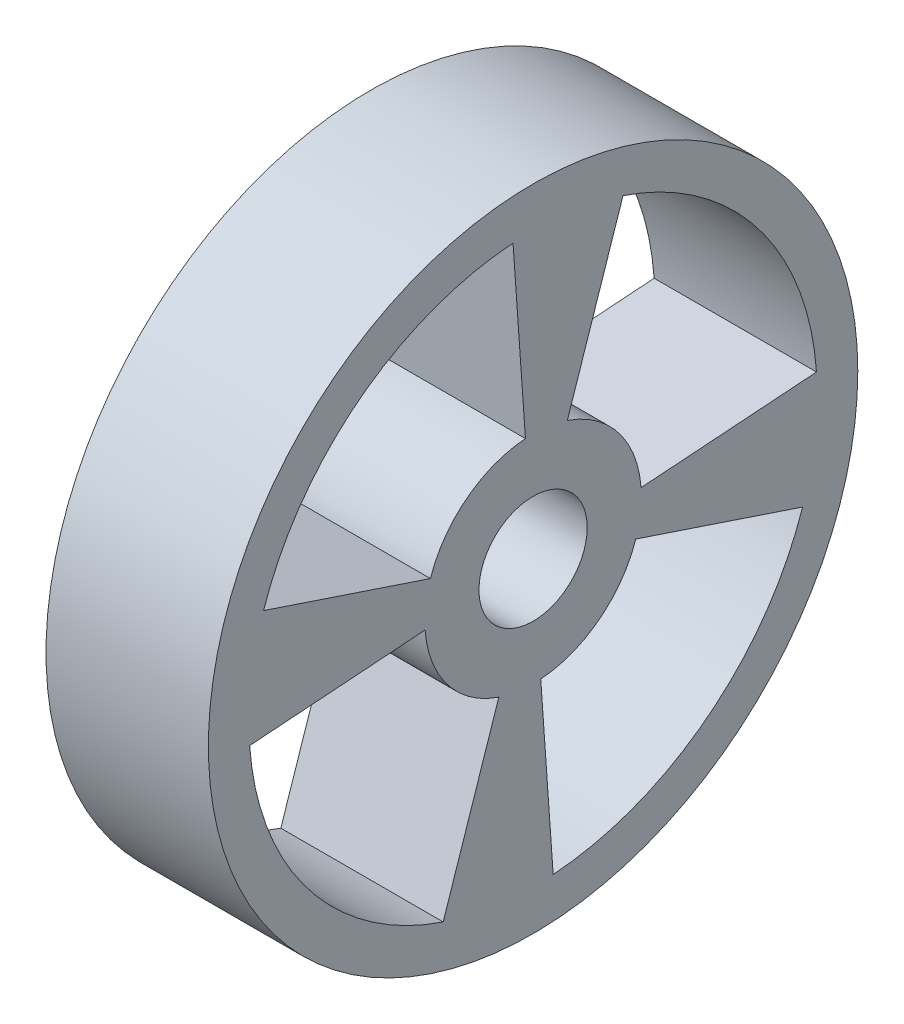
ISO-10303-21;
HEADER;
FILE_DESCRIPTION(('STEP AP214'),'2;1');
FILE_NAME('part.step','',(''),(''),'','','');
FILE_SCHEMA(('AUTOMOTIVE_DESIGN { 1 0 10303 214 1 1 1 1 }'));
ENDSEC;
DATA;
#1=APPLICATION_CONTEXT('core data for automotive mechanical design processes');
#2=APPLICATION_PROTOCOL_DEFINITION('international standard','automotive_design',2000,#1);
#3=PRODUCT_CONTEXT('',#1,'mechanical');
#4=PRODUCT('Part','Part','',(#3));
#5=PRODUCT_RELATED_PRODUCT_CATEGORY('part','',(#4));
#6=PRODUCT_DEFINITION_FORMATION('','',#4);
#7=PRODUCT_DEFINITION_CONTEXT('part definition',#1,'design');
#8=PRODUCT_DEFINITION('design','',#6,#7);
#9=PRODUCT_DEFINITION_SHAPE('','',#8);
#10=(LENGTH_UNIT() NAMED_UNIT(*) SI_UNIT(.MILLI.,.METRE.));
#11=(NAMED_UNIT(*) PLANE_ANGLE_UNIT() SI_UNIT($,.RADIAN.));
#12=(NAMED_UNIT(*) SI_UNIT($,.STERADIAN.) SOLID_ANGLE_UNIT());
#13=UNCERTAINTY_MEASURE_WITH_UNIT(LENGTH_MEASURE(1.E-05),#10,'distance_accuracy_value','');
#14=(GEOMETRIC_REPRESENTATION_CONTEXT(3) GLOBAL_UNCERTAINTY_ASSIGNED_CONTEXT((#13)) GLOBAL_UNIT_ASSIGNED_CONTEXT((#10,
#11,#12)) REPRESENTATION_CONTEXT('',''));
#15=CARTESIAN_POINT('',(0.,0.,0.));
#16=DIRECTION('',(0.,0.,1.));
#17=DIRECTION('',(1.,0.,0.));
#18=AXIS2_PLACEMENT_3D('',#15,#16,#17);
#19=CARTESIAN_POINT('',(6.,0.,0.));
#20=DIRECTION('',(-1.,0.,0.));
#21=DIRECTION('',(0.,0.,1.));
#22=AXIS2_PLACEMENT_3D('',#19,#20,#21);
#23=CYLINDRICAL_SURFACE('',#22,10.5);
#24=CARTESIAN_POINT('',(0.,0.,0.));
#25=DIRECTION('',(1.,0.,0.));
#26=DIRECTION('',(0.,0.,-1.));
#27=AXIS2_PLACEMENT_3D('',#24,#25,#26);
#28=CIRCLE('',#27,10.5);
#29=CARTESIAN_POINT('',(0.,0.741872062862505,-10.4737589165659));
#30=VERTEX_POINT('',#29);
#31=CARTESIAN_POINT('',(0.,9.96039363886485,-3.32273359733529));
#32=VERTEX_POINT('',#31);
#33=EDGE_CURVE('E210',#30,#32,#28,.T.);
#34=ORIENTED_EDGE('',*,*,#33,.F.);
#35=DIRECTION('',(-1.,0.,0.));
#36=VECTOR('',#35,1.);
#37=CARTESIAN_POINT('',(6.,0.741872062862505,-10.4737589165659));
#38=LINE('',#37,#36);
#39=CARTESIAN_POINT('',(6.,0.741872062862505,-10.4737589165659));
#40=VERTEX_POINT('',#39);
#41=EDGE_CURVE('E11',#40,#30,#38,.T.);
#42=ORIENTED_EDGE('',*,*,#41,.F.);
#43=CARTESIAN_POINT('',(6.,0.,0.));
#44=DIRECTION('',(1.,0.,0.));
#45=DIRECTION('',(0.,0.,-1.));
#46=AXIS2_PLACEMENT_3D('',#43,#44,#45);
#47=CIRCLE('',#46,10.5);
#48=CARTESIAN_POINT('',(6.,9.96039363886485,-3.32273359733529));
#49=VERTEX_POINT('',#48);
#50=EDGE_CURVE('E179',#40,#49,#47,.T.);
#51=ORIENTED_EDGE('',*,*,#50,.T.);
#52=DIRECTION('',(-1.,0.,0.));
#53=VECTOR('',#52,1.);
#54=CARTESIAN_POINT('',(6.,9.96039363886485,-3.32273359733529));
#55=LINE('',#54,#53);
#56=EDGE_CURVE('E114',#49,#32,#55,.T.);
#57=ORIENTED_EDGE('',*,*,#56,.T.);
#58=EDGE_LOOP('',(#34,#42,#51,#57));
#59=FACE_BOUND('',#58,.T.);
#60=ADVANCED_FACE('F36',(#59),#23,.F.);
#61=CARTESIAN_POINT('',(6.,0.,0.));
#62=DIRECTION('',(0.,0.997500849196754,0.0706544821773814));
#63=DIRECTION('',(0.,-0.0706544821773815,0.997500849196755));
#64=AXIS2_PLACEMENT_3D('',#61,#62,#63);
#65=PLANE('',#64);
#66=DIRECTION('',(0.,0.0706544821773815,-0.997500849196755));
#67=VECTOR('',#66,1.);
#68=CARTESIAN_POINT('',(0.,0.,0.));
#69=LINE('',#68,#67);
#70=CARTESIAN_POINT('',(0.,0.282617928709526,-3.99000339678702));
#71=VERTEX_POINT('',#70);
#72=EDGE_CURVE('E166',#71,#30,#69,.T.);
#73=ORIENTED_EDGE('',*,*,#72,.F.);
#74=DIRECTION('',(-1.,0.,0.));
#75=VECTOR('',#74,1.);
#76=CARTESIAN_POINT('',(6.,0.282617928709526,-3.99000339678702));
#77=LINE('',#76,#75);
#78=CARTESIAN_POINT('',(6.,0.282617928709526,-3.99000339678702));
#79=VERTEX_POINT('',#78);
#80=EDGE_CURVE('E46',#79,#71,#77,.T.);
#81=ORIENTED_EDGE('',*,*,#80,.F.);
#82=DIRECTION('',(0.,0.0706544821773815,-0.997500849196755));
#83=VECTOR('',#82,1.);
#84=CARTESIAN_POINT('',(6.,0.,0.));
#85=LINE('',#84,#83);
#86=EDGE_CURVE('E164',#79,#40,#85,.T.);
#87=ORIENTED_EDGE('',*,*,#86,.T.);
#88=ORIENTED_EDGE('',*,*,#41,.T.);
#89=EDGE_LOOP('',(#73,#81,#87,#88));
#90=FACE_BOUND('',#89,.T.);
#91=ADVANCED_FACE('F162',(#90),#65,.T.);
#92=CARTESIAN_POINT('',(6.,0.,0.));
#93=DIRECTION('',(-1.,0.,0.));
#94=DIRECTION('',(0.,0.,1.));
#95=AXIS2_PLACEMENT_3D('',#92,#93,#94);
#96=CYLINDRICAL_SURFACE('',#95,4.);
#97=CARTESIAN_POINT('',(0.,0.,0.));
#98=DIRECTION('',(1.,0.,0.));
#99=DIRECTION('',(0.,0.,-1.));
#100=AXIS2_PLACEMENT_3D('',#97,#98,#99);
#101=CIRCLE('',#100,4.);
#102=CARTESIAN_POINT('',(0.,3.79443567194851,-1.26580327517535));
#103=VERTEX_POINT('',#102);
#104=EDGE_CURVE('E202',#71,#103,#101,.T.);
#105=ORIENTED_EDGE('',*,*,#104,.T.);
#106=DIRECTION('',(-1.,0.,0.));
#107=VECTOR('',#106,1.);
#108=CARTESIAN_POINT('',(6.,3.79443567194851,-1.26580327517535));
#109=LINE('',#108,#107);
#110=CARTESIAN_POINT('',(6.,3.79443567194851,-1.26580327517535));
#111=VERTEX_POINT('',#110);
#112=EDGE_CURVE('E169',#111,#103,#109,.T.);
#113=ORIENTED_EDGE('',*,*,#112,.F.);
#114=CARTESIAN_POINT('',(6.,0.,0.));
#115=DIRECTION('',(1.,0.,0.));
#116=DIRECTION('',(0.,0.,-1.));
#117=AXIS2_PLACEMENT_3D('',#114,#115,#116);
#118=CIRCLE('',#117,4.);
#119=EDGE_CURVE('E172',#79,#111,#118,.T.);
#120=ORIENTED_EDGE('',*,*,#119,.F.);
#121=ORIENTED_EDGE('',*,*,#80,.T.);
#122=EDGE_LOOP('',(#105,#113,#120,#121));
#123=FACE_BOUND('',#122,.T.);
#124=ADVANCED_FACE('F173',(#123),#96,.T.);
#125=CARTESIAN_POINT('',(6.,0.,0.));
#126=DIRECTION('',(0.,-0.0706544821773849,0.997500849196754));
#127=DIRECTION('',(0.,-0.997500849196754,-0.0706544821773849));
#128=AXIS2_PLACEMENT_3D('',#125,#126,#127);
#129=PLANE('',#128);
#130=DIRECTION('',(0.,0.997500849196754,0.0706544821773849));
#131=VECTOR('',#130,1.);
#132=CARTESIAN_POINT('',(0.,0.,0.));
#133=LINE('',#132,#131);
#134=CARTESIAN_POINT('',(0.,3.99000339678702,0.28261792870954));
#135=VERTEX_POINT('',#134);
#136=CARTESIAN_POINT('',(0.,10.4737589165659,0.741872062862542));
#137=VERTEX_POINT('',#136);
#138=EDGE_CURVE('E217',#135,#137,#133,.T.);
#139=ORIENTED_EDGE('',*,*,#138,.F.);
#140=DIRECTION('',(-1.,0.,0.));
#141=VECTOR('',#140,1.);
#142=CARTESIAN_POINT('',(6.,3.99000339678702,0.28261792870954));
#143=LINE('',#142,#141);
#144=CARTESIAN_POINT('',(6.,3.99000339678702,0.28261792870954));
#145=VERTEX_POINT('',#144);
#146=EDGE_CURVE('E235',#145,#135,#143,.T.);
#147=ORIENTED_EDGE('',*,*,#146,.F.);
#148=DIRECTION('',(0.,0.997500849196754,0.0706544821773849));
#149=VECTOR('',#148,1.);
#150=CARTESIAN_POINT('',(6.,0.,0.));
#151=LINE('',#150,#149);
#152=CARTESIAN_POINT('',(6.,10.4737589165659,0.741872062862542));
#153=VERTEX_POINT('',#152);
#154=EDGE_CURVE('E380',#145,#153,#151,.T.);
#155=ORIENTED_EDGE('',*,*,#154,.T.);
#156=DIRECTION('',(-1.,0.,0.));
#157=VECTOR('',#156,1.);
#158=CARTESIAN_POINT('',(6.,10.4737589165659,0.741872062862542));
#159=LINE('',#158,#157);
#160=EDGE_CURVE('E237',#153,#137,#159,.T.);
#161=ORIENTED_EDGE('',*,*,#160,.T.);
#162=EDGE_LOOP('',(#139,#147,#155,#161));
#163=FACE_BOUND('',#162,.T.);
#164=ADVANCED_FACE('F351',(#163),#129,.T.);
#165=CARTESIAN_POINT('',(0.,1.26580327517539,3.7944356719485));
#166=VERTEX_POINT('',#165);
#167=EDGE_CURVE('E220',#135,#166,#101,.T.);
#168=ORIENTED_EDGE('',*,*,#167,.T.);
#169=DIRECTION('',(-1.,0.,0.));
#170=VECTOR('',#169,1.);
#171=CARTESIAN_POINT('',(6.,1.26580327517539,3.7944356719485));
#172=LINE('',#171,#170);
#173=CARTESIAN_POINT('',(6.,1.26580327517539,3.7944356719485));
#174=VERTEX_POINT('',#173);
#175=EDGE_CURVE('E242',#174,#166,#172,.T.);
#176=ORIENTED_EDGE('',*,*,#175,.F.);
#177=EDGE_CURVE('E175',#145,#174,#118,.T.);
#178=ORIENTED_EDGE('',*,*,#177,.F.);
#179=ORIENTED_EDGE('',*,*,#146,.T.);
#180=EDGE_LOOP('',(#168,#176,#178,#179));
#181=FACE_BOUND('',#180,.T.);
#182=ADVANCED_FACE('F352',(#181),#96,.T.);
#183=CARTESIAN_POINT('',(6.,0.,0.));
#184=DIRECTION('',(0.,-0.948608917987125,0.316450818793847));
#185=DIRECTION('',(0.,-0.316450818793847,-0.948608917987125));
#186=AXIS2_PLACEMENT_3D('',#183,#184,#185);
#187=PLANE('',#186);
#188=DIRECTION('',(0.,0.316450818793847,0.948608917987125));
#189=VECTOR('',#188,1.);
#190=CARTESIAN_POINT('',(0.,0.,0.));
#191=LINE('',#190,#189);
#192=CARTESIAN_POINT('',(0.,3.32273359733539,9.96039363886481));
#193=VERTEX_POINT('',#192);
#194=EDGE_CURVE('E221',#166,#193,#191,.T.);
#195=ORIENTED_EDGE('',*,*,#194,.T.);
#196=DIRECTION('',(-1.,0.,0.));
#197=VECTOR('',#196,1.);
#198=CARTESIAN_POINT('',(6.,3.32273359733539,9.96039363886481));
#199=LINE('',#198,#197);
#200=CARTESIAN_POINT('',(6.,3.32273359733539,9.96039363886481));
#201=VERTEX_POINT('',#200);
#202=EDGE_CURVE('E239',#201,#193,#199,.T.);
#203=ORIENTED_EDGE('',*,*,#202,.F.);
#204=DIRECTION('',(0.,0.316450818793847,0.948608917987125));
#205=VECTOR('',#204,1.);
#206=CARTESIAN_POINT('',(6.,0.,0.));
#207=LINE('',#206,#205);
#208=EDGE_CURVE('E186',#174,#201,#207,.T.);
#209=ORIENTED_EDGE('',*,*,#208,.F.);
#210=ORIENTED_EDGE('',*,*,#175,.T.);
#211=EDGE_LOOP('',(#195,#203,#209,#210));
#212=FACE_BOUND('',#211,.T.);
#213=ADVANCED_FACE('F359',(#212),#187,.F.);
#214=CARTESIAN_POINT('',(6.,0.,0.));
#215=DIRECTION('',(0.,-0.997500849196755,-0.0706544821773745));
#216=DIRECTION('',(0.,0.0706544821773745,-0.997500849196755));
#217=AXIS2_PLACEMENT_3D('',#214,#215,#216);
#218=PLANE('',#217);
#219=DIRECTION('',(0.,-0.0706544821773745,0.997500849196755));
#220=VECTOR('',#219,1.);
#221=CARTESIAN_POINT('',(0.,0.,0.));
#222=LINE('',#221,#220);
#223=CARTESIAN_POINT('',(0.,-0.282617928709498,3.99000339678702));
#224=VERTEX_POINT('',#223);
#225=CARTESIAN_POINT('',(0.,-0.741872062862432,10.4737589165659));
#226=VERTEX_POINT('',#225);
#227=EDGE_CURVE('E209',#224,#226,#222,.T.);
#228=ORIENTED_EDGE('',*,*,#227,.F.);
#229=DIRECTION('',(-1.,0.,0.));
#230=VECTOR('',#229,1.);
#231=CARTESIAN_POINT('',(6.,-0.282617928709498,3.99000339678702));
#232=LINE('',#231,#230);
#233=CARTESIAN_POINT('',(6.,-0.282617928709498,3.99000339678702));
#234=VERTEX_POINT('',#233);
#235=EDGE_CURVE('E240',#234,#224,#232,.T.);
#236=ORIENTED_EDGE('',*,*,#235,.F.);
#237=DIRECTION('',(0.,-0.0706544821773745,0.997500849196755));
#238=VECTOR('',#237,1.);
#239=CARTESIAN_POINT('',(6.,0.,0.));
#240=LINE('',#239,#238);
#241=CARTESIAN_POINT('',(6.,-0.741872062862432,10.4737589165659));
#242=VERTEX_POINT('',#241);
#243=EDGE_CURVE('E375',#234,#242,#240,.T.);
#244=ORIENTED_EDGE('',*,*,#243,.T.);
#245=DIRECTION('',(-1.,0.,0.));
#246=VECTOR('',#245,1.);
#247=CARTESIAN_POINT('',(6.,-0.741872062862432,10.4737589165659));
#248=LINE('',#247,#246);
#249=EDGE_CURVE('E246',#242,#226,#248,.T.);
#250=ORIENTED_EDGE('',*,*,#249,.T.);
#251=EDGE_LOOP('',(#228,#236,#244,#250));
#252=FACE_BOUND('',#251,.T.);
#253=ADVANCED_FACE('F363',(#252),#218,.T.);
#254=CARTESIAN_POINT('',(0.,-3.7944356719485,1.26580327517537));
#255=VERTEX_POINT('',#254);
#256=EDGE_CURVE('E203',#224,#255,#101,.T.);
#257=ORIENTED_EDGE('',*,*,#256,.T.);
#258=DIRECTION('',(-1.,0.,0.));
#259=VECTOR('',#258,1.);
#260=CARTESIAN_POINT('',(6.,-3.7944356719485,1.26580327517537));
#261=LINE('',#260,#259);
#262=CARTESIAN_POINT('',(6.,-3.7944356719485,1.26580327517537));
#263=VERTEX_POINT('',#262);
#264=EDGE_CURVE('E250',#263,#255,#261,.T.);
#265=ORIENTED_EDGE('',*,*,#264,.F.);
#266=EDGE_CURVE('E377',#234,#263,#118,.T.);
#267=ORIENTED_EDGE('',*,*,#266,.F.);
#268=ORIENTED_EDGE('',*,*,#235,.T.);
#269=EDGE_LOOP('',(#257,#265,#267,#268));
#270=FACE_BOUND('',#269,.T.);
#271=ADVANCED_FACE('F286',(#270),#96,.T.);
#272=CARTESIAN_POINT('',(6.,0.,0.));
#273=DIRECTION('',(0.,-0.31645081879382,-0.948608917987134));
#274=DIRECTION('',(0.,0.948608917987134,-0.31645081879382));
#275=AXIS2_PLACEMENT_3D('',#272,#273,#274);
#276=PLANE('',#275);
#277=DIRECTION('',(0.,-0.948608917987134,0.31645081879382));
#278=VECTOR('',#277,1.);
#279=CARTESIAN_POINT('',(0.,0.,0.));
#280=LINE('',#279,#278);
#281=CARTESIAN_POINT('',(0.,-9.96039363886477,3.32273359733517));
#282=VERTEX_POINT('',#281);
#283=EDGE_CURVE('E214',#255,#282,#280,.T.);
#284=ORIENTED_EDGE('',*,*,#283,.T.);
#285=DIRECTION('',(-1.,0.,0.));
#286=VECTOR('',#285,1.);
#287=CARTESIAN_POINT('',(6.,-9.96039363886477,3.32273359733517));
#288=LINE('',#287,#286);
#289=CARTESIAN_POINT('',(6.,-9.96039363886477,3.32273359733517));
#290=VERTEX_POINT('',#289);
#291=EDGE_CURVE('E248',#290,#282,#288,.T.);
#292=ORIENTED_EDGE('',*,*,#291,.F.);
#293=DIRECTION('',(0.,-0.948608917987134,0.31645081879382));
#294=VECTOR('',#293,1.);
#295=CARTESIAN_POINT('',(6.,0.,0.));
#296=LINE('',#295,#294);
#297=EDGE_CURVE('E327',#263,#290,#296,.T.);
#298=ORIENTED_EDGE('',*,*,#297,.F.);
#299=ORIENTED_EDGE('',*,*,#264,.T.);
#300=EDGE_LOOP('',(#284,#292,#298,#299));
#301=FACE_BOUND('',#300,.T.);
#302=ADVANCED_FACE('F324',(#301),#276,.F.);
#303=CARTESIAN_POINT('',(6.,0.,1.22965707227772E-13));
#304=DIRECTION('',(0.,0.0706544821774087,-0.997500849196753));
#305=DIRECTION('',(0.,0.997500849196753,0.0706544821774087));
#306=AXIS2_PLACEMENT_3D('',#303,#304,#305);
#307=PLANE('',#306);
#308=DIRECTION('',(0.,-0.997500849196752,-0.0706544821774087));
#309=VECTOR('',#308,1.);
#310=CARTESIAN_POINT('',(0.,0.,1.22965707227772E-13));
#311=LINE('',#310,#309);
#312=CARTESIAN_POINT('',(0.,-3.99000339678702,-0.282617928709512));
#313=VERTEX_POINT('',#312);
#314=CARTESIAN_POINT('',(0.,-10.4737589165658,-0.741872062862661));
#315=VERTEX_POINT('',#314);
#316=EDGE_CURVE('E196',#313,#315,#311,.T.);
#317=ORIENTED_EDGE('',*,*,#316,.F.);
#318=DIRECTION('',(-1.,0.,0.));
#319=VECTOR('',#318,1.);
#320=CARTESIAN_POINT('',(6.,-3.99000339678702,-0.282617928709512));
#321=LINE('',#320,#319);
#322=CARTESIAN_POINT('',(6.,-3.99000339678702,-0.282617928709512));
#323=VERTEX_POINT('',#322);
#324=EDGE_CURVE('E40',#323,#313,#321,.T.);
#325=ORIENTED_EDGE('',*,*,#324,.F.);
#326=DIRECTION('',(0.,-0.997500849196752,-0.0706544821774087));
#327=VECTOR('',#326,1.);
#328=CARTESIAN_POINT('',(6.,0.,1.22965707227772E-13));
#329=LINE('',#328,#327);
#330=CARTESIAN_POINT('',(6.,-10.4737589165658,-0.741872062862661));
#331=VERTEX_POINT('',#330);
#332=EDGE_CURVE('E233',#323,#331,#329,.T.);
#333=ORIENTED_EDGE('',*,*,#332,.T.);
#334=DIRECTION('',(-1.,0.,0.));
#335=VECTOR('',#334,1.);
#336=CARTESIAN_POINT('',(6.,-10.4737589165658,-0.741872062862661));
#337=LINE('',#336,#335);
#338=EDGE_CURVE('E195',#331,#315,#337,.T.);
#339=ORIENTED_EDGE('',*,*,#338,.T.);
#340=EDGE_LOOP('',(#317,#325,#333,#339));
#341=FACE_BOUND('',#340,.T.);
#342=ADVANCED_FACE('F38',(#341),#307,.T.);
#343=CARTESIAN_POINT('',(0.,-1.26580327517536,-3.79443567194851));
#344=VERTEX_POINT('',#343);
#345=EDGE_CURVE('E199',#313,#344,#101,.T.);
#346=ORIENTED_EDGE('',*,*,#345,.T.);
#347=DIRECTION('',(-1.,0.,0.));
#348=VECTOR('',#347,1.);
#349=CARTESIAN_POINT('',(6.,-1.26580327517536,-3.79443567194851));
#350=LINE('',#349,#348);
#351=CARTESIAN_POINT('',(6.,-1.26580327517536,-3.79443567194851));
#352=VERTEX_POINT('',#351);
#353=EDGE_CURVE('E256',#352,#344,#350,.T.);
#354=ORIENTED_EDGE('',*,*,#353,.F.);
#355=EDGE_CURVE('E176',#323,#352,#118,.T.);
#356=ORIENTED_EDGE('',*,*,#355,.F.);
#357=ORIENTED_EDGE('',*,*,#324,.T.);
#358=EDGE_LOOP('',(#346,#354,#356,#357));
#359=FACE_BOUND('',#358,.T.);
#360=ADVANCED_FACE('F264',(#359),#96,.T.);
#361=CARTESIAN_POINT('',(6.,0.,0.));
#362=DIRECTION('',(0.,0.948608917987127,-0.31645081879384));
#363=DIRECTION('',(0.,0.31645081879384,0.948608917987127));
#364=AXIS2_PLACEMENT_3D('',#361,#362,#363);
#365=PLANE('',#364);
#366=DIRECTION('',(0.,-0.31645081879384,-0.948608917987127));
#367=VECTOR('',#366,1.);
#368=CARTESIAN_POINT('',(0.,0.,0.));
#369=LINE('',#368,#367);
#370=CARTESIAN_POINT('',(0.,-3.32273359733532,-9.96039363886484));
#371=VERTEX_POINT('',#370);
#372=EDGE_CURVE('E201',#344,#371,#369,.T.);
#373=ORIENTED_EDGE('',*,*,#372,.T.);
#374=DIRECTION('',(-1.,0.,0.));
#375=VECTOR('',#374,1.);
#376=CARTESIAN_POINT('',(6.,-3.32273359733532,-9.96039363886484));
#377=LINE('',#376,#375);
#378=CARTESIAN_POINT('',(6.,-3.32273359733532,-9.96039363886484));
#379=VERTEX_POINT('',#378);
#380=EDGE_CURVE('E255',#379,#371,#377,.T.);
#381=ORIENTED_EDGE('',*,*,#380,.F.);
#382=DIRECTION('',(0.,-0.31645081879384,-0.948608917987127));
#383=VECTOR('',#382,1.);
#384=CARTESIAN_POINT('',(6.,0.,0.));
#385=LINE('',#384,#383);
#386=EDGE_CURVE('E383',#352,#379,#385,.T.);
#387=ORIENTED_EDGE('',*,*,#386,.F.);
#388=ORIENTED_EDGE('',*,*,#353,.T.);
#389=EDGE_LOOP('',(#373,#381,#387,#388));
#390=FACE_BOUND('',#389,.T.);
#391=ADVANCED_FACE('F275',(#390),#365,.F.);
#392=CARTESIAN_POINT('',(6.,0.,0.));
#393=DIRECTION('',(-1.,0.,0.));
#394=DIRECTION('',(0.,0.,1.));
#395=AXIS2_PLACEMENT_3D('',#392,#393,#394);
#396=CYLINDRICAL_SURFACE('',#395,12.);
#397=CARTESIAN_POINT('',(6.,0.,0.));
#398=DIRECTION('',(1.,0.,0.));
#399=DIRECTION('',(0.,0.,-1.));
#400=AXIS2_PLACEMENT_3D('',#397,#398,#399);
#401=CIRCLE('',#400,12.);
#402=CARTESIAN_POINT('',(6.,0.,-12.));
#403=VERTEX_POINT('',#402);
#404=EDGE_CURVE('E189',#403,#403,#401,.T.);
#405=ORIENTED_EDGE('',*,*,#404,.F.);
#406=EDGE_LOOP('',(#405));
#407=FACE_BOUND('',#406,.T.);
#408=CARTESIAN_POINT('',(0.,0.,0.));
#409=DIRECTION('',(1.,0.,0.));
#410=DIRECTION('',(0.,0.,-1.));
#411=AXIS2_PLACEMENT_3D('',#408,#409,#410);
#412=CIRCLE('',#411,12.);
#413=CARTESIAN_POINT('',(0.,0.,-12.));
#414=VERTEX_POINT('',#413);
#415=EDGE_CURVE('E227',#414,#414,#412,.T.);
#416=ORIENTED_EDGE('',*,*,#415,.T.);
#417=EDGE_LOOP('',(#416));
#418=FACE_BOUND('',#417,.T.);
#419=ADVANCED_FACE('F277',(#407,#418),#396,.T.);
#420=CARTESIAN_POINT('',(6.,0.,0.));
#421=DIRECTION('',(0.,0.316450818793837,0.948608917987128));
#422=DIRECTION('',(0.,-0.948608917987128,0.316450818793837));
#423=AXIS2_PLACEMENT_3D('',#420,#421,#422);
#424=PLANE('',#423);
#425=DIRECTION('',(0.,0.948608917987128,-0.316450818793837));
#426=VECTOR('',#425,1.);
#427=CARTESIAN_POINT('',(0.,0.,0.));
#428=LINE('',#427,#426);
#429=EDGE_CURVE('E107',#103,#32,#428,.T.);
#430=ORIENTED_EDGE('',*,*,#429,.T.);
#431=ORIENTED_EDGE('',*,*,#56,.F.);
#432=DIRECTION('',(0.,0.948608917987128,-0.316450818793837));
#433=VECTOR('',#432,1.);
#434=CARTESIAN_POINT('',(6.,0.,0.));
#435=LINE('',#434,#433);
#436=EDGE_CURVE('E55',#111,#49,#435,.T.);
#437=ORIENTED_EDGE('',*,*,#436,.F.);
#438=ORIENTED_EDGE('',*,*,#112,.T.);
#439=EDGE_LOOP('',(#430,#431,#437,#438));
#440=FACE_BOUND('',#439,.T.);
#441=ADVANCED_FACE('F282',(#440),#424,.F.);
#442=EDGE_CURVE('E224',#137,#193,#28,.T.);
#443=ORIENTED_EDGE('',*,*,#442,.F.);
#444=ORIENTED_EDGE('',*,*,#160,.F.);
#445=EDGE_CURVE('E181',#153,#201,#47,.T.);
#446=ORIENTED_EDGE('',*,*,#445,.T.);
#447=ORIENTED_EDGE('',*,*,#202,.T.);
#448=EDGE_LOOP('',(#443,#444,#446,#447));
#449=FACE_BOUND('',#448,.T.);
#450=ADVANCED_FACE('F290',(#449),#23,.F.);
#451=EDGE_CURVE('E211',#226,#282,#28,.T.);
#452=ORIENTED_EDGE('',*,*,#451,.F.);
#453=ORIENTED_EDGE('',*,*,#249,.F.);
#454=EDGE_CURVE('E322',#242,#290,#47,.T.);
#455=ORIENTED_EDGE('',*,*,#454,.T.);
#456=ORIENTED_EDGE('',*,*,#291,.T.);
#457=EDGE_LOOP('',(#452,#453,#455,#456));
#458=FACE_BOUND('',#457,.T.);
#459=ADVANCED_FACE('F298',(#458),#23,.F.);
#460=EDGE_CURVE('E206',#315,#371,#28,.T.);
#461=ORIENTED_EDGE('',*,*,#460,.F.);
#462=ORIENTED_EDGE('',*,*,#338,.F.);
#463=EDGE_CURVE('E183',#331,#379,#47,.T.);
#464=ORIENTED_EDGE('',*,*,#463,.T.);
#465=ORIENTED_EDGE('',*,*,#380,.T.);
#466=EDGE_LOOP('',(#461,#462,#464,#465));
#467=FACE_BOUND('',#466,.T.);
#468=ADVANCED_FACE('F273',(#467),#23,.F.);
#469=CARTESIAN_POINT('',(6.,0.,0.));
#470=DIRECTION('',(-1.,0.,0.));
#471=DIRECTION('',(0.,0.,1.));
#472=AXIS2_PLACEMENT_3D('',#469,#470,#471);
#473=CYLINDRICAL_SURFACE('',#472,2.);
#474=CARTESIAN_POINT('',(6.,0.,0.));
#475=DIRECTION('',(1.,0.,0.));
#476=DIRECTION('',(0.,0.,-1.));
#477=AXIS2_PLACEMENT_3D('',#474,#475,#476);
#478=CIRCLE('',#477,2.);
#479=CARTESIAN_POINT('',(6.,0.,-2.));
#480=VERTEX_POINT('',#479);
#481=EDGE_CURVE('E192',#480,#480,#478,.T.);
#482=ORIENTED_EDGE('',*,*,#481,.T.);
#483=EDGE_LOOP('',(#482));
#484=FACE_BOUND('',#483,.T.);
#485=CARTESIAN_POINT('',(0.,0.,0.));
#486=DIRECTION('',(1.,0.,0.));
#487=DIRECTION('',(0.,0.,-1.));
#488=AXIS2_PLACEMENT_3D('',#485,#486,#487);
#489=CIRCLE('',#488,2.);
#490=CARTESIAN_POINT('',(0.,0.,-2.));
#491=VERTEX_POINT('',#490);
#492=EDGE_CURVE('E230',#491,#491,#489,.T.);
#493=ORIENTED_EDGE('',*,*,#492,.F.);
#494=EDGE_LOOP('',(#493));
#495=FACE_BOUND('',#494,.T.);
#496=ADVANCED_FACE('F297',(#484,#495),#473,.F.);
#497=CARTESIAN_POINT('',(6.,0.,0.));
#498=DIRECTION('',(1.,0.,0.));
#499=DIRECTION('',(0.,0.,-1.));
#500=AXIS2_PLACEMENT_3D('',#497,#498,#499);
#501=PLANE('',#500);
#502=ORIENTED_EDGE('',*,*,#332,.F.);
#503=ORIENTED_EDGE('',*,*,#355,.T.);
#504=ORIENTED_EDGE('',*,*,#386,.T.);
#505=ORIENTED_EDGE('',*,*,#463,.F.);
#506=EDGE_LOOP('',(#502,#503,#504,#505));
#507=FACE_BOUND('',#506,.T.);
#508=ORIENTED_EDGE('',*,*,#243,.F.);
#509=ORIENTED_EDGE('',*,*,#266,.T.);
#510=ORIENTED_EDGE('',*,*,#297,.T.);
#511=ORIENTED_EDGE('',*,*,#454,.F.);
#512=EDGE_LOOP('',(#508,#509,#510,#511));
#513=FACE_BOUND('',#512,.T.);
#514=ORIENTED_EDGE('',*,*,#154,.F.);
#515=ORIENTED_EDGE('',*,*,#177,.T.);
#516=ORIENTED_EDGE('',*,*,#208,.T.);
#517=ORIENTED_EDGE('',*,*,#445,.F.);
#518=EDGE_LOOP('',(#514,#515,#516,#517));
#519=FACE_BOUND('',#518,.T.);
#520=ORIENTED_EDGE('',*,*,#50,.F.);
#521=ORIENTED_EDGE('',*,*,#86,.F.);
#522=ORIENTED_EDGE('',*,*,#119,.T.);
#523=ORIENTED_EDGE('',*,*,#436,.T.);
#524=EDGE_LOOP('',(#520,#521,#522,#523));
#525=FACE_BOUND('',#524,.T.);
#526=ORIENTED_EDGE('',*,*,#404,.T.);
#527=EDGE_LOOP('',(#526));
#528=FACE_BOUND('',#527,.T.);
#529=ORIENTED_EDGE('',*,*,#481,.F.);
#530=EDGE_LOOP('',(#529));
#531=FACE_BOUND('',#530,.T.);
#532=ADVANCED_FACE('F177',(#507,#513,#519,#525,#528,#531),#501,.T.);
#533=CARTESIAN_POINT('',(0.,0.,0.));
#534=DIRECTION('',(1.,0.,0.));
#535=DIRECTION('',(0.,0.,-1.));
#536=AXIS2_PLACEMENT_3D('',#533,#534,#535);
#537=PLANE('',#536);
#538=ORIENTED_EDGE('',*,*,#316,.T.);
#539=ORIENTED_EDGE('',*,*,#460,.T.);
#540=ORIENTED_EDGE('',*,*,#372,.F.);
#541=ORIENTED_EDGE('',*,*,#345,.F.);
#542=EDGE_LOOP('',(#538,#539,#540,#541));
#543=FACE_BOUND('',#542,.T.);
#544=ORIENTED_EDGE('',*,*,#227,.T.);
#545=ORIENTED_EDGE('',*,*,#451,.T.);
#546=ORIENTED_EDGE('',*,*,#283,.F.);
#547=ORIENTED_EDGE('',*,*,#256,.F.);
#548=EDGE_LOOP('',(#544,#545,#546,#547));
#549=FACE_BOUND('',#548,.T.);
#550=ORIENTED_EDGE('',*,*,#138,.T.);
#551=ORIENTED_EDGE('',*,*,#442,.T.);
#552=ORIENTED_EDGE('',*,*,#194,.F.);
#553=ORIENTED_EDGE('',*,*,#167,.F.);
#554=EDGE_LOOP('',(#550,#551,#552,#553));
#555=FACE_BOUND('',#554,.T.);
#556=ORIENTED_EDGE('',*,*,#33,.T.);
#557=ORIENTED_EDGE('',*,*,#429,.F.);
#558=ORIENTED_EDGE('',*,*,#104,.F.);
#559=ORIENTED_EDGE('',*,*,#72,.T.);
#560=EDGE_LOOP('',(#556,#557,#558,#559));
#561=FACE_BOUND('',#560,.T.);
#562=ORIENTED_EDGE('',*,*,#415,.F.);
#563=EDGE_LOOP('',(#562));
#564=FACE_BOUND('',#563,.T.);
#565=ORIENTED_EDGE('',*,*,#492,.T.);
#566=EDGE_LOOP('',(#565));
#567=FACE_BOUND('',#566,.T.);
#568=ADVANCED_FACE('F267',(#543,#549,#555,#561,#564,#567),#537,.F.);
#569=CLOSED_SHELL('',(#60,#91,#124,#164,#182,#213,#253,#271,#302,#342,#360,#391,#419,#441,#450,
#459,#468,#496,#532,#568));
#570=MANIFOLD_SOLID_BREP('B2',#569);
#571=ADVANCED_BREP_SHAPE_REPRESENTATION('',(#18,#570),#14);
#572=SHAPE_DEFINITION_REPRESENTATION(#9,#571);
ENDSEC;
END-ISO-10303-21;
